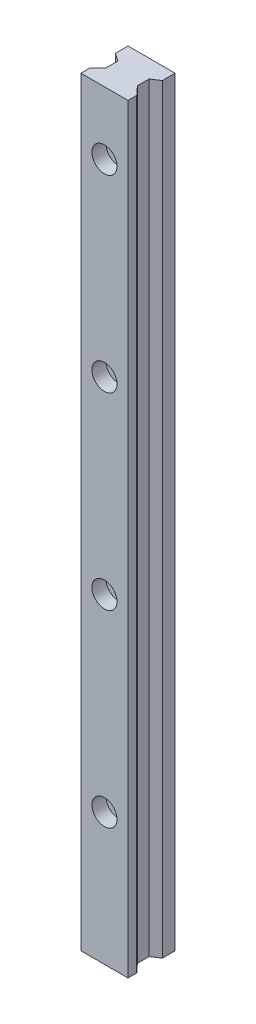
ISO-10303-21;
HEADER;
FILE_DESCRIPTION(('STEP AP214'),'2;1');
FILE_NAME('part.step','',(''),(''),'','','');
FILE_SCHEMA(('AUTOMOTIVE_DESIGN { 1 0 10303 214 1 1 1 1 }'));
ENDSEC;
DATA;
#1=APPLICATION_CONTEXT('core data for automotive mechanical design processes');
#2=APPLICATION_PROTOCOL_DEFINITION('international standard','automotive_design',2000,#1);
#3=PRODUCT_CONTEXT('',#1,'mechanical');
#4=PRODUCT('Part','Part','',(#3));
#5=PRODUCT_RELATED_PRODUCT_CATEGORY('part','',(#4));
#6=PRODUCT_DEFINITION_FORMATION('','',#4);
#7=PRODUCT_DEFINITION_CONTEXT('part definition',#1,'design');
#8=PRODUCT_DEFINITION('design','',#6,#7);
#9=PRODUCT_DEFINITION_SHAPE('','',#8);
#10=(LENGTH_UNIT() NAMED_UNIT(*) SI_UNIT(.MILLI.,.METRE.));
#11=(NAMED_UNIT(*) PLANE_ANGLE_UNIT() SI_UNIT($,.RADIAN.));
#12=(NAMED_UNIT(*) SI_UNIT($,.STERADIAN.) SOLID_ANGLE_UNIT());
#13=UNCERTAINTY_MEASURE_WITH_UNIT(LENGTH_MEASURE(1.E-05),#10,'distance_accuracy_value','');
#14=(GEOMETRIC_REPRESENTATION_CONTEXT(3) GLOBAL_UNCERTAINTY_ASSIGNED_CONTEXT((#13)) GLOBAL_UNIT_ASSIGNED_CONTEXT((#10,
#11,#12)) REPRESENTATION_CONTEXT('',''));
#15=CARTESIAN_POINT('',(0.,0.,0.));
#16=DIRECTION('',(0.,0.,1.));
#17=DIRECTION('',(1.,0.,0.));
#18=AXIS2_PLACEMENT_3D('',#15,#16,#17);
#19=CARTESIAN_POINT('',(0.,638.5,15.));
#20=DIRECTION('',(0.,0.,1.));
#21=DIRECTION('',(1.,0.,0.));
#22=AXIS2_PLACEMENT_3D('',#19,#20,#21);
#23=CYLINDRICAL_SURFACE('',#22,4.);
#24=CARTESIAN_POINT('',(0.,638.5,15.));
#25=DIRECTION('',(0.,0.,1.));
#26=DIRECTION('',(1.,0.,0.));
#27=AXIS2_PLACEMENT_3D('',#24,#25,#26);
#28=CIRCLE('',#27,4.);
#29=CARTESIAN_POINT('',(4.,638.5,15.));
#30=VERTEX_POINT('',#29);
#31=EDGE_CURVE('E142',#30,#30,#28,.F.);
#32=ORIENTED_EDGE('',*,*,#31,.F.);
#33=EDGE_LOOP('',(#32));
#34=FACE_BOUND('',#33,.T.);
#35=CARTESIAN_POINT('',(0.,638.5,10.5));
#36=DIRECTION('',(0.,0.,1.));
#37=DIRECTION('',(1.,0.,0.));
#38=AXIS2_PLACEMENT_3D('',#35,#36,#37);
#39=CIRCLE('',#38,4.);
#40=CARTESIAN_POINT('',(4.,638.5,10.5));
#41=VERTEX_POINT('',#40);
#42=EDGE_CURVE('E19',#41,#41,#39,.F.);
#43=ORIENTED_EDGE('',*,*,#42,.T.);
#44=EDGE_LOOP('',(#43));
#45=FACE_BOUND('',#44,.T.);
#46=ADVANCED_FACE('F16',(#34,#45),#23,.F.);
#47=CARTESIAN_POINT('',(0.,578.5,15.));
#48=DIRECTION('',(0.,0.,1.));
#49=DIRECTION('',(1.,0.,0.));
#50=AXIS2_PLACEMENT_3D('',#47,#48,#49);
#51=CYLINDRICAL_SURFACE('',#50,4.);
#52=CARTESIAN_POINT('',(0.,578.5,15.));
#53=DIRECTION('',(0.,0.,1.));
#54=DIRECTION('',(1.,0.,0.));
#55=AXIS2_PLACEMENT_3D('',#52,#53,#54);
#56=CIRCLE('',#55,4.);
#57=CARTESIAN_POINT('',(4.,578.5,15.));
#58=VERTEX_POINT('',#57);
#59=EDGE_CURVE('E178',#58,#58,#56,.F.);
#60=ORIENTED_EDGE('',*,*,#59,.F.);
#61=EDGE_LOOP('',(#60));
#62=FACE_BOUND('',#61,.T.);
#63=CARTESIAN_POINT('',(0.,578.5,10.5));
#64=DIRECTION('',(0.,0.,1.));
#65=DIRECTION('',(1.,0.,0.));
#66=AXIS2_PLACEMENT_3D('',#63,#64,#65);
#67=CIRCLE('',#66,4.);
#68=CARTESIAN_POINT('',(4.,578.5,10.5));
#69=VERTEX_POINT('',#68);
#70=EDGE_CURVE('E187',#69,#69,#67,.F.);
#71=ORIENTED_EDGE('',*,*,#70,.T.);
#72=EDGE_LOOP('',(#71));
#73=FACE_BOUND('',#72,.T.);
#74=ADVANCED_FACE('F292',(#62,#73),#51,.F.);
#75=CARTESIAN_POINT('',(0.,518.5,15.));
#76=DIRECTION('',(0.,0.,1.));
#77=DIRECTION('',(1.,0.,0.));
#78=AXIS2_PLACEMENT_3D('',#75,#76,#77);
#79=CYLINDRICAL_SURFACE('',#78,4.);
#80=CARTESIAN_POINT('',(0.,518.5,15.));
#81=DIRECTION('',(0.,0.,1.));
#82=DIRECTION('',(1.,0.,0.));
#83=AXIS2_PLACEMENT_3D('',#80,#81,#82);
#84=CIRCLE('',#83,4.);
#85=CARTESIAN_POINT('',(4.,518.5,15.));
#86=VERTEX_POINT('',#85);
#87=EDGE_CURVE('E175',#86,#86,#84,.F.);
#88=ORIENTED_EDGE('',*,*,#87,.F.);
#89=EDGE_LOOP('',(#88));
#90=FACE_BOUND('',#89,.T.);
#91=CARTESIAN_POINT('',(0.,518.5,10.5));
#92=DIRECTION('',(0.,0.,1.));
#93=DIRECTION('',(1.,0.,0.));
#94=AXIS2_PLACEMENT_3D('',#91,#92,#93);
#95=CIRCLE('',#94,4.);
#96=CARTESIAN_POINT('',(4.,518.5,10.5));
#97=VERTEX_POINT('',#96);
#98=EDGE_CURVE('E185',#97,#97,#95,.F.);
#99=ORIENTED_EDGE('',*,*,#98,.T.);
#100=EDGE_LOOP('',(#99));
#101=FACE_BOUND('',#100,.T.);
#102=ADVANCED_FACE('F289',(#90,#101),#79,.F.);
#103=CARTESIAN_POINT('',(0.,458.5,15.));
#104=DIRECTION('',(0.,0.,1.));
#105=DIRECTION('',(1.,0.,0.));
#106=AXIS2_PLACEMENT_3D('',#103,#104,#105);
#107=CYLINDRICAL_SURFACE('',#106,4.);
#108=CARTESIAN_POINT('',(0.,458.5,15.));
#109=DIRECTION('',(0.,0.,1.));
#110=DIRECTION('',(1.,0.,0.));
#111=AXIS2_PLACEMENT_3D('',#108,#109,#110);
#112=CIRCLE('',#111,4.);
#113=CARTESIAN_POINT('',(4.,458.5,15.));
#114=VERTEX_POINT('',#113);
#115=EDGE_CURVE('E140',#114,#114,#112,.F.);
#116=ORIENTED_EDGE('',*,*,#115,.F.);
#117=EDGE_LOOP('',(#116));
#118=FACE_BOUND('',#117,.T.);
#119=CARTESIAN_POINT('',(0.,458.5,10.5));
#120=DIRECTION('',(0.,0.,1.));
#121=DIRECTION('',(1.,0.,0.));
#122=AXIS2_PLACEMENT_3D('',#119,#120,#121);
#123=CIRCLE('',#122,4.);
#124=CARTESIAN_POINT('',(4.,458.5,10.5));
#125=VERTEX_POINT('',#124);
#126=EDGE_CURVE('E151',#125,#125,#123,.F.);
#127=ORIENTED_EDGE('',*,*,#126,.T.);
#128=EDGE_LOOP('',(#127));
#129=FACE_BOUND('',#128,.T.);
#130=ADVANCED_FACE('F199',(#118,#129),#107,.F.);
#131=CARTESIAN_POINT('',(2.25,638.5,10.5));
#132=DIRECTION('',(0.,0.,-1.));
#133=DIRECTION('',(-1.,0.,0.));
#134=AXIS2_PLACEMENT_3D('',#131,#132,#133);
#135=PLANE('',#134);
#136=ORIENTED_EDGE('',*,*,#42,.F.);
#137=EDGE_LOOP('',(#136));
#138=FACE_BOUND('',#137,.T.);
#139=CARTESIAN_POINT('',(0.,638.5,10.5));
#140=DIRECTION('',(0.,0.,1.));
#141=DIRECTION('',(1.,0.,0.));
#142=AXIS2_PLACEMENT_3D('',#139,#140,#141);
#143=CIRCLE('',#142,2.25);
#144=CARTESIAN_POINT('',(2.25,638.5,10.5));
#145=VERTEX_POINT('',#144);
#146=EDGE_CURVE('E139',#145,#145,#143,.F.);
#147=ORIENTED_EDGE('',*,*,#146,.T.);
#148=EDGE_LOOP('',(#147));
#149=FACE_BOUND('',#148,.T.);
#150=ADVANCED_FACE('F195',(#138,#149),#135,.F.);
#151=CARTESIAN_POINT('',(2.25,578.5,10.5));
#152=DIRECTION('',(0.,0.,-1.));
#153=DIRECTION('',(-1.,0.,0.));
#154=AXIS2_PLACEMENT_3D('',#151,#152,#153);
#155=PLANE('',#154);
#156=ORIENTED_EDGE('',*,*,#70,.F.);
#157=EDGE_LOOP('',(#156));
#158=FACE_BOUND('',#157,.T.);
#159=CARTESIAN_POINT('',(0.,578.5,10.5));
#160=DIRECTION('',(0.,0.,1.));
#161=DIRECTION('',(1.,0.,0.));
#162=AXIS2_PLACEMENT_3D('',#159,#160,#161);
#163=CIRCLE('',#162,2.25);
#164=CARTESIAN_POINT('',(2.25,578.5,10.5));
#165=VERTEX_POINT('',#164);
#166=EDGE_CURVE('E168',#165,#165,#163,.F.);
#167=ORIENTED_EDGE('',*,*,#166,.T.);
#168=EDGE_LOOP('',(#167));
#169=FACE_BOUND('',#168,.T.);
#170=ADVANCED_FACE('F198',(#158,#169),#155,.F.);
#171=CARTESIAN_POINT('',(2.25,518.5,10.5));
#172=DIRECTION('',(0.,0.,-1.));
#173=DIRECTION('',(-1.,0.,0.));
#174=AXIS2_PLACEMENT_3D('',#171,#172,#173);
#175=PLANE('',#174);
#176=ORIENTED_EDGE('',*,*,#98,.F.);
#177=EDGE_LOOP('',(#176));
#178=FACE_BOUND('',#177,.T.);
#179=CARTESIAN_POINT('',(0.,518.5,10.5));
#180=DIRECTION('',(0.,0.,1.));
#181=DIRECTION('',(1.,0.,0.));
#182=AXIS2_PLACEMENT_3D('',#179,#180,#181);
#183=CIRCLE('',#182,2.25);
#184=CARTESIAN_POINT('',(2.25,518.5,10.5));
#185=VERTEX_POINT('',#184);
#186=EDGE_CURVE('E133',#185,#185,#183,.F.);
#187=ORIENTED_EDGE('',*,*,#186,.T.);
#188=EDGE_LOOP('',(#187));
#189=FACE_BOUND('',#188,.T.);
#190=ADVANCED_FACE('F279',(#178,#189),#175,.F.);
#191=CARTESIAN_POINT('',(2.25,458.5,10.5));
#192=DIRECTION('',(0.,0.,-1.));
#193=DIRECTION('',(-1.,0.,0.));
#194=AXIS2_PLACEMENT_3D('',#191,#192,#193);
#195=PLANE('',#194);
#196=ORIENTED_EDGE('',*,*,#126,.F.);
#197=EDGE_LOOP('',(#196));
#198=FACE_BOUND('',#197,.T.);
#199=CARTESIAN_POINT('',(0.,458.5,10.5));
#200=DIRECTION('',(0.,0.,1.));
#201=DIRECTION('',(1.,0.,0.));
#202=AXIS2_PLACEMENT_3D('',#199,#200,#201);
#203=CIRCLE('',#202,2.25);
#204=CARTESIAN_POINT('',(2.25,458.5,10.5));
#205=VERTEX_POINT('',#204);
#206=EDGE_CURVE('E130',#205,#205,#203,.F.);
#207=ORIENTED_EDGE('',*,*,#206,.T.);
#208=EDGE_LOOP('',(#207));
#209=FACE_BOUND('',#208,.T.);
#210=ADVANCED_FACE('F275',(#198,#209),#195,.F.);
#211=CARTESIAN_POINT('',(7.5,200.,15.));
#212=DIRECTION('',(-1.,0.,0.));
#213=DIRECTION('',(0.,0.,1.));
#214=AXIS2_PLACEMENT_3D('',#211,#212,#213);
#215=PLANE('',#214);
#216=DIRECTION('',(0.,0.,1.));
#217=VECTOR('',#216,1.);
#218=CARTESIAN_POINT('',(7.5,416.5,-200.));
#219=LINE('',#218,#217);
#220=CARTESIAN_POINT('',(7.5,416.5,15.));
#221=VERTEX_POINT('',#220);
#222=CARTESIAN_POINT('',(7.50000000000001,416.5,12.21727469374));
#223=VERTEX_POINT('',#222);
#224=EDGE_CURVE('E355',#221,#223,#219,.F.);
#225=ORIENTED_EDGE('',*,*,#224,.T.);
#226=DIRECTION('',(0.,1.,0.));
#227=VECTOR('',#226,1.);
#228=CARTESIAN_POINT('',(7.5,200.,12.21727469374));
#229=LINE('',#228,#227);
#230=CARTESIAN_POINT('',(7.5,658.5,12.21727469374));
#231=VERTEX_POINT('',#230);
#232=EDGE_CURVE('E149',#223,#231,#229,.T.);
#233=ORIENTED_EDGE('',*,*,#232,.T.);
#234=DIRECTION('',(0.,0.,-1.));
#235=VECTOR('',#234,1.);
#236=CARTESIAN_POINT('',(7.5,658.5,-200.));
#237=LINE('',#236,#235);
#238=CARTESIAN_POINT('',(7.5,658.5,15.));
#239=VERTEX_POINT('',#238);
#240=EDGE_CURVE('E312',#231,#239,#237,.F.);
#241=ORIENTED_EDGE('',*,*,#240,.T.);
#242=DIRECTION('',(0.,1.,0.));
#243=VECTOR('',#242,1.);
#244=CARTESIAN_POINT('',(7.5,0.,15.));
#245=LINE('',#244,#243);
#246=EDGE_CURVE('E117',#221,#239,#245,.T.);
#247=ORIENTED_EDGE('',*,*,#246,.F.);
#248=EDGE_LOOP('',(#225,#233,#241,#247));
#249=FACE_BOUND('',#248,.T.);
#250=ADVANCED_FACE('F271',(#249),#215,.F.);
#251=CARTESIAN_POINT('',(7.5,200.,12.21727469374));
#252=DIRECTION('',(-0.73519614364749,0.,0.67785443154549));
#253=DIRECTION('',(0.67785443154549,0.,0.73519614364749));
#254=AXIS2_PLACEMENT_3D('',#251,#252,#253);
#255=PLANE('',#254);
#256=DIRECTION('',(-0.677854431545408,0.,-0.735196143647565));
#257=VECTOR('',#256,1.);
#258=CARTESIAN_POINT('',(7.5,416.5,12.21727469374));
#259=LINE('',#258,#257);
#260=CARTESIAN_POINT('',(4.95415811693084,416.5,9.45607251276214));
#261=VERTEX_POINT('',#260);
#262=EDGE_CURVE('E352',#223,#261,#259,.T.);
#263=ORIENTED_EDGE('',*,*,#262,.T.);
#264=DIRECTION('',(0.,1.,0.));
#265=VECTOR('',#264,1.);
#266=CARTESIAN_POINT('',(4.954158116931,200.,9.456072512762));
#267=LINE('',#266,#265);
#268=CARTESIAN_POINT('',(4.95415811693093,658.5,9.4560725127621));
#269=VERTEX_POINT('',#268);
#270=EDGE_CURVE('E147',#261,#269,#267,.T.);
#271=ORIENTED_EDGE('',*,*,#270,.T.);
#272=DIRECTION('',(0.677854431545408,0.,0.735196143647565));
#273=VECTOR('',#272,1.);
#274=CARTESIAN_POINT('',(4.954158116931,658.5,9.45607251276201));
#275=LINE('',#274,#273);
#276=EDGE_CURVE('E317',#269,#231,#275,.T.);
#277=ORIENTED_EDGE('',*,*,#276,.T.);
#278=ORIENTED_EDGE('',*,*,#232,.F.);
#279=EDGE_LOOP('',(#263,#271,#277,#278));
#280=FACE_BOUND('',#279,.T.);
#281=ADVANCED_FACE('F267',(#280),#255,.F.);
#282=CARTESIAN_POINT('',(4.954158116931,200.,9.456072512762));
#283=DIRECTION('',(-1.,0.,0.));
#284=DIRECTION('',(0.,0.,1.));
#285=AXIS2_PLACEMENT_3D('',#282,#283,#284);
#286=PLANE('',#285);
#287=DIRECTION('',(0.,0.,1.));
#288=VECTOR('',#287,1.);
#289=CARTESIAN_POINT('',(4.954158116931,416.5,-200.));
#290=LINE('',#289,#288);
#291=CARTESIAN_POINT('',(4.954158116931,416.5,5.731298607799));
#292=VERTEX_POINT('',#291);
#293=EDGE_CURVE('E349',#261,#292,#290,.F.);
#294=ORIENTED_EDGE('',*,*,#293,.T.);
#295=DIRECTION('',(0.,1.,0.));
#296=VECTOR('',#295,1.);
#297=CARTESIAN_POINT('',(4.954158116931,200.,5.731298607799));
#298=LINE('',#297,#296);
#299=CARTESIAN_POINT('',(4.954158116931,658.5,5.731298607799));
#300=VERTEX_POINT('',#299);
#301=EDGE_CURVE('E137',#292,#300,#298,.T.);
#302=ORIENTED_EDGE('',*,*,#301,.T.);
#303=DIRECTION('',(0.,0.,-1.));
#304=VECTOR('',#303,1.);
#305=CARTESIAN_POINT('',(4.954158116931,658.5,-200.));
#306=LINE('',#305,#304);
#307=EDGE_CURVE('E323',#300,#269,#306,.F.);
#308=ORIENTED_EDGE('',*,*,#307,.T.);
#309=ORIENTED_EDGE('',*,*,#270,.F.);
#310=EDGE_LOOP('',(#294,#302,#308,#309));
#311=FACE_BOUND('',#310,.T.);
#312=ADVANCED_FACE('F263',(#311),#286,.F.);
#313=CARTESIAN_POINT('',(-4.954158116931,200.,5.731298607799));
#314=DIRECTION('',(0.551556138662193,0.,-0.834137773934289));
#315=DIRECTION('',(-0.834137773934289,0.,-0.551556138662193));
#316=AXIS2_PLACEMENT_3D('',#313,#314,#315);
#317=PLANE('',#316);
#318=DIRECTION('',(0.834137773934291,0.,0.55155613866219));
#319=VECTOR('',#318,1.);
#320=CARTESIAN_POINT('',(-7.5,416.5,4.04791396493948));
#321=LINE('',#320,#319);
#322=CARTESIAN_POINT('',(-7.50000000000001,416.5,4.04791396493922));
#323=VERTEX_POINT('',#322);
#324=CARTESIAN_POINT('',(-4.954158116931,416.5,5.731298607799));
#325=VERTEX_POINT('',#324);
#326=EDGE_CURVE('E339',#323,#325,#321,.T.);
#327=ORIENTED_EDGE('',*,*,#326,.T.);
#328=DIRECTION('',(0.,1.,0.));
#329=VECTOR('',#328,1.);
#330=CARTESIAN_POINT('',(-4.954158116931,200.,5.731298607799));
#331=LINE('',#330,#329);
#332=CARTESIAN_POINT('',(-4.954158116931,658.5,5.731298607799));
#333=VERTEX_POINT('',#332);
#334=EDGE_CURVE('E145',#325,#333,#331,.T.);
#335=ORIENTED_EDGE('',*,*,#334,.T.);
#336=DIRECTION('',(-0.83413777393422,0.,-0.551556138662298));
#337=VECTOR('',#336,1.);
#338=CARTESIAN_POINT('',(-4.954158116931,658.5,5.731298607799));
#339=LINE('',#338,#337);
#340=CARTESIAN_POINT('',(-7.5,658.5,4.04791396493912));
#341=VERTEX_POINT('',#340);
#342=EDGE_CURVE('E329',#333,#341,#339,.T.);
#343=ORIENTED_EDGE('',*,*,#342,.T.);
#344=DIRECTION('',(0.,1.,0.));
#345=VECTOR('',#344,1.);
#346=CARTESIAN_POINT('',(-7.5,200.,4.047913964939));
#347=LINE('',#346,#345);
#348=EDGE_CURVE('E315',#341,#323,#347,.F.);
#349=ORIENTED_EDGE('',*,*,#348,.T.);
#350=EDGE_LOOP('',(#327,#335,#343,#349));
#351=FACE_BOUND('',#350,.T.);
#352=ADVANCED_FACE('F259',(#351),#317,.F.);
#353=CARTESIAN_POINT('',(-4.954158116931,200.,9.456072512762));
#354=DIRECTION('',(1.,0.,0.));
#355=DIRECTION('',(0.,0.,-1.));
#356=AXIS2_PLACEMENT_3D('',#353,#354,#355);
#357=PLANE('',#356);
#358=DIRECTION('',(0.,0.,1.));
#359=VECTOR('',#358,1.);
#360=CARTESIAN_POINT('',(-4.954158116931,416.5,-200.));
#361=LINE('',#360,#359);
#362=CARTESIAN_POINT('',(-4.95415811693095,416.5,9.45607251276231));
#363=VERTEX_POINT('',#362);
#364=EDGE_CURVE('E332',#325,#363,#361,.T.);
#365=ORIENTED_EDGE('',*,*,#364,.T.);
#366=DIRECTION('',(0.,1.,0.));
#367=VECTOR('',#366,1.);
#368=CARTESIAN_POINT('',(-4.95415811693083,200.,9.45607251276244));
#369=LINE('',#368,#367);
#370=CARTESIAN_POINT('',(-4.95415811693091,658.5,9.45607251276236));
#371=VERTEX_POINT('',#370);
#372=EDGE_CURVE('E118',#363,#371,#369,.T.);
#373=ORIENTED_EDGE('',*,*,#372,.T.);
#374=DIRECTION('',(0.,0.,-1.));
#375=VECTOR('',#374,1.);
#376=CARTESIAN_POINT('',(-4.954158116931,658.5,-200.));
#377=LINE('',#376,#375);
#378=EDGE_CURVE('E125',#371,#333,#377,.T.);
#379=ORIENTED_EDGE('',*,*,#378,.T.);
#380=ORIENTED_EDGE('',*,*,#334,.F.);
#381=EDGE_LOOP('',(#365,#373,#379,#380));
#382=FACE_BOUND('',#381,.T.);
#383=ADVANCED_FACE('F256',(#382),#357,.F.);
#384=CARTESIAN_POINT('',(-7.5,200.,12.21727469374));
#385=DIRECTION('',(0.73519614364749,0.,0.67785443154549));
#386=DIRECTION('',(0.67785443154549,0.,-0.73519614364749));
#387=AXIS2_PLACEMENT_3D('',#384,#385,#386);
#388=PLANE('',#387);
#389=DIRECTION('',(-0.677854431545445,0.,0.735196143647531));
#390=VECTOR('',#389,1.);
#391=CARTESIAN_POINT('',(-4.954158116931,416.5,9.45607251276229));
#392=LINE('',#391,#390);
#393=CARTESIAN_POINT('',(-7.5,416.5,12.21727469374));
#394=VERTEX_POINT('',#393);
#395=EDGE_CURVE('E113',#363,#394,#392,.T.);
#396=ORIENTED_EDGE('',*,*,#395,.T.);
#397=DIRECTION('',(0.,1.,0.));
#398=VECTOR('',#397,1.);
#399=CARTESIAN_POINT('',(-7.5,200.,12.21727469374));
#400=LINE('',#399,#398);
#401=CARTESIAN_POINT('',(-7.5,658.5,12.21727469374));
#402=VERTEX_POINT('',#401);
#403=EDGE_CURVE('E109',#394,#402,#400,.T.);
#404=ORIENTED_EDGE('',*,*,#403,.T.);
#405=DIRECTION('',(0.677854431545445,0.,-0.735196143647531));
#406=VECTOR('',#405,1.);
#407=CARTESIAN_POINT('',(-7.5,658.5,12.21727469374));
#408=LINE('',#407,#406);
#409=EDGE_CURVE('E111',#402,#371,#408,.T.);
#410=ORIENTED_EDGE('',*,*,#409,.T.);
#411=ORIENTED_EDGE('',*,*,#372,.F.);
#412=EDGE_LOOP('',(#396,#404,#410,#411));
#413=FACE_BOUND('',#412,.T.);
#414=ADVANCED_FACE('F110',(#413),#388,.F.);
#415=CARTESIAN_POINT('',(-7.5,200.,15.));
#416=DIRECTION('',(1.,0.,0.));
#417=DIRECTION('',(0.,0.,-1.));
#418=AXIS2_PLACEMENT_3D('',#415,#416,#417);
#419=PLANE('',#418);
#420=DIRECTION('',(0.,0.,1.));
#421=VECTOR('',#420,1.);
#422=CARTESIAN_POINT('',(-7.5,416.5,-200.));
#423=LINE('',#422,#421);
#424=CARTESIAN_POINT('',(-7.5,416.5,15.));
#425=VERTEX_POINT('',#424);
#426=EDGE_CURVE('E335',#394,#425,#423,.T.);
#427=ORIENTED_EDGE('',*,*,#426,.T.);
#428=DIRECTION('',(0.,1.,0.));
#429=VECTOR('',#428,1.);
#430=CARTESIAN_POINT('',(-7.5,0.,15.));
#431=LINE('',#430,#429);
#432=CARTESIAN_POINT('',(-7.5,658.5,15.));
#433=VERTEX_POINT('',#432);
#434=EDGE_CURVE('E128',#433,#425,#431,.F.);
#435=ORIENTED_EDGE('',*,*,#434,.F.);
#436=DIRECTION('',(0.,0.,-1.));
#437=VECTOR('',#436,1.);
#438=CARTESIAN_POINT('',(-7.5,658.5,-200.));
#439=LINE('',#438,#437);
#440=EDGE_CURVE('E103',#433,#402,#439,.T.);
#441=ORIENTED_EDGE('',*,*,#440,.T.);
#442=ORIENTED_EDGE('',*,*,#403,.F.);
#443=EDGE_LOOP('',(#427,#435,#441,#442));
#444=FACE_BOUND('',#443,.T.);
#445=ADVANCED_FACE('F127',(#444),#419,.F.);
#446=CARTESIAN_POINT('',(0.,0.,15.));
#447=DIRECTION('',(0.,0.,1.));
#448=DIRECTION('',(1.,0.,0.));
#449=AXIS2_PLACEMENT_3D('',#446,#447,#448);
#450=PLANE('',#449);
#451=ORIENTED_EDGE('',*,*,#115,.T.);
#452=EDGE_LOOP('',(#451));
#453=FACE_BOUND('',#452,.T.);
#454=ORIENTED_EDGE('',*,*,#87,.T.);
#455=EDGE_LOOP('',(#454));
#456=FACE_BOUND('',#455,.T.);
#457=ORIENTED_EDGE('',*,*,#59,.T.);
#458=EDGE_LOOP('',(#457));
#459=FACE_BOUND('',#458,.T.);
#460=ORIENTED_EDGE('',*,*,#31,.T.);
#461=EDGE_LOOP('',(#460));
#462=FACE_BOUND('',#461,.T.);
#463=DIRECTION('',(1.,0.,0.));
#464=VECTOR('',#463,1.);
#465=CARTESIAN_POINT('',(-43.6398609986848,658.5,15.));
#466=LINE('',#465,#464);
#467=EDGE_CURVE('E306',#239,#433,#466,.F.);
#468=ORIENTED_EDGE('',*,*,#467,.T.);
#469=ORIENTED_EDGE('',*,*,#434,.T.);
#470=DIRECTION('',(1.,0.,0.));
#471=VECTOR('',#470,1.);
#472=CARTESIAN_POINT('',(-15.8348903814837,416.5,15.));
#473=LINE('',#472,#471);
#474=EDGE_CURVE('E337',#425,#221,#473,.T.);
#475=ORIENTED_EDGE('',*,*,#474,.T.);
#476=ORIENTED_EDGE('',*,*,#246,.T.);
#477=EDGE_LOOP('',(#468,#469,#475,#476));
#478=FACE_BOUND('',#477,.T.);
#479=ADVANCED_FACE('F247',(#453,#456,#459,#462,#478),#450,.T.);
#480=CARTESIAN_POINT('',(4.954158116931,200.,5.731298607799));
#481=DIRECTION('',(-0.551556138662193,0.,-0.834137773934289));
#482=DIRECTION('',(-0.834137773934289,0.,0.551556138662193));
#483=AXIS2_PLACEMENT_3D('',#480,#481,#482);
#484=PLANE('',#483);
#485=DIRECTION('',(0.83413777393422,0.,-0.551556138662298));
#486=VECTOR('',#485,1.);
#487=CARTESIAN_POINT('',(4.954158116931,416.5,5.731298607799));
#488=LINE('',#487,#486);
#489=CARTESIAN_POINT('',(7.50000000000005,416.5,4.04791396493908));
#490=VERTEX_POINT('',#489);
#491=EDGE_CURVE('E347',#292,#490,#488,.T.);
#492=ORIENTED_EDGE('',*,*,#491,.T.);
#493=DIRECTION('',(0.,1.,0.));
#494=VECTOR('',#493,1.);
#495=CARTESIAN_POINT('',(7.5,200.,4.047913964939));
#496=LINE('',#495,#494);
#497=CARTESIAN_POINT('',(7.50000000000006,658.5,4.04791396493906));
#498=VERTEX_POINT('',#497);
#499=EDGE_CURVE('E164',#490,#498,#496,.T.);
#500=ORIENTED_EDGE('',*,*,#499,.T.);
#501=DIRECTION('',(-0.83413777393422,0.,0.551556138662298));
#502=VECTOR('',#501,1.);
#503=CARTESIAN_POINT('',(7.5,658.5,4.047913964939));
#504=LINE('',#503,#502);
#505=EDGE_CURVE('E326',#498,#300,#504,.T.);
#506=ORIENTED_EDGE('',*,*,#505,.T.);
#507=ORIENTED_EDGE('',*,*,#301,.F.);
#508=EDGE_LOOP('',(#492,#500,#506,#507));
#509=FACE_BOUND('',#508,.T.);
#510=ADVANCED_FACE('F207',(#509),#484,.F.);
#511=CARTESIAN_POINT('',(0.,638.5,15.));
#512=DIRECTION('',(0.,0.,1.));
#513=DIRECTION('',(1.,0.,0.));
#514=AXIS2_PLACEMENT_3D('',#511,#512,#513);
#515=CYLINDRICAL_SURFACE('',#514,2.25);
#516=ORIENTED_EDGE('',*,*,#146,.F.);
#517=EDGE_LOOP('',(#516));
#518=FACE_BOUND('',#517,.T.);
#519=CARTESIAN_POINT('',(0.,638.5,0.));
#520=DIRECTION('',(0.,0.,1.));
#521=DIRECTION('',(1.,0.,0.));
#522=AXIS2_PLACEMENT_3D('',#519,#520,#521);
#523=CIRCLE('',#522,2.25);
#524=CARTESIAN_POINT('',(2.25,638.5,0.));
#525=VERTEX_POINT('',#524);
#526=EDGE_CURVE('E162',#525,#525,#523,.F.);
#527=ORIENTED_EDGE('',*,*,#526,.T.);
#528=EDGE_LOOP('',(#527));
#529=FACE_BOUND('',#528,.T.);
#530=ADVANCED_FACE('F203',(#518,#529),#515,.F.);
#531=CARTESIAN_POINT('',(0.,578.5,15.));
#532=DIRECTION('',(0.,0.,1.));
#533=DIRECTION('',(1.,0.,0.));
#534=AXIS2_PLACEMENT_3D('',#531,#532,#533);
#535=CYLINDRICAL_SURFACE('',#534,2.25);
#536=ORIENTED_EDGE('',*,*,#166,.F.);
#537=EDGE_LOOP('',(#536));
#538=FACE_BOUND('',#537,.T.);
#539=CARTESIAN_POINT('',(0.,578.5,0.));
#540=DIRECTION('',(0.,0.,1.));
#541=DIRECTION('',(1.,0.,0.));
#542=AXIS2_PLACEMENT_3D('',#539,#540,#541);
#543=CIRCLE('',#542,2.25);
#544=CARTESIAN_POINT('',(2.25,578.5,0.));
#545=VERTEX_POINT('',#544);
#546=EDGE_CURVE('E159',#545,#545,#543,.F.);
#547=ORIENTED_EDGE('',*,*,#546,.T.);
#548=EDGE_LOOP('',(#547));
#549=FACE_BOUND('',#548,.T.);
#550=ADVANCED_FACE('F206',(#538,#549),#535,.F.);
#551=CARTESIAN_POINT('',(0.,518.5,15.));
#552=DIRECTION('',(0.,0.,1.));
#553=DIRECTION('',(1.,0.,0.));
#554=AXIS2_PLACEMENT_3D('',#551,#552,#553);
#555=CYLINDRICAL_SURFACE('',#554,2.25);
#556=ORIENTED_EDGE('',*,*,#186,.F.);
#557=EDGE_LOOP('',(#556));
#558=FACE_BOUND('',#557,.T.);
#559=CARTESIAN_POINT('',(0.,518.5,0.));
#560=DIRECTION('',(0.,0.,1.));
#561=DIRECTION('',(1.,0.,0.));
#562=AXIS2_PLACEMENT_3D('',#559,#560,#561);
#563=CIRCLE('',#562,2.25);
#564=CARTESIAN_POINT('',(2.25,518.5,0.));
#565=VERTEX_POINT('',#564);
#566=EDGE_CURVE('E156',#565,#565,#563,.F.);
#567=ORIENTED_EDGE('',*,*,#566,.T.);
#568=EDGE_LOOP('',(#567));
#569=FACE_BOUND('',#568,.T.);
#570=ADVANCED_FACE('F237',(#558,#569),#555,.F.);
#571=CARTESIAN_POINT('',(0.,458.5,15.));
#572=DIRECTION('',(0.,0.,1.));
#573=DIRECTION('',(1.,0.,0.));
#574=AXIS2_PLACEMENT_3D('',#571,#572,#573);
#575=CYLINDRICAL_SURFACE('',#574,2.25);
#576=ORIENTED_EDGE('',*,*,#206,.F.);
#577=EDGE_LOOP('',(#576));
#578=FACE_BOUND('',#577,.T.);
#579=CARTESIAN_POINT('',(0.,458.5,0.));
#580=DIRECTION('',(0.,0.,1.));
#581=DIRECTION('',(1.,0.,0.));
#582=AXIS2_PLACEMENT_3D('',#579,#580,#581);
#583=CIRCLE('',#582,2.25);
#584=CARTESIAN_POINT('',(2.25,458.5,0.));
#585=VERTEX_POINT('',#584);
#586=EDGE_CURVE('E152',#585,#585,#583,.F.);
#587=ORIENTED_EDGE('',*,*,#586,.T.);
#588=EDGE_LOOP('',(#587));
#589=FACE_BOUND('',#588,.T.);
#590=ADVANCED_FACE('F234',(#578,#589),#575,.F.);
#591=CARTESIAN_POINT('',(-43.6398609986848,658.5,-200.));
#592=DIRECTION('',(0.,-1.,0.));
#593=DIRECTION('',(0.,0.,-1.));
#594=AXIS2_PLACEMENT_3D('',#591,#592,#593);
#595=PLANE('',#594);
#596=ORIENTED_EDGE('',*,*,#240,.F.);
#597=ORIENTED_EDGE('',*,*,#276,.F.);
#598=ORIENTED_EDGE('',*,*,#307,.F.);
#599=ORIENTED_EDGE('',*,*,#505,.F.);
#600=DIRECTION('',(0.,0.,1.));
#601=VECTOR('',#600,1.);
#602=CARTESIAN_POINT('',(7.5,658.5,15.));
#603=LINE('',#602,#601);
#604=CARTESIAN_POINT('',(7.5,658.5,0.));
#605=VERTEX_POINT('',#604);
#606=EDGE_CURVE('E370',#498,#605,#603,.F.);
#607=ORIENTED_EDGE('',*,*,#606,.T.);
#608=DIRECTION('',(1.,0.,0.));
#609=VECTOR('',#608,1.);
#610=CARTESIAN_POINT('',(0.,658.5,0.));
#611=LINE('',#610,#609);
#612=CARTESIAN_POINT('',(-7.5,658.5,0.));
#613=VERTEX_POINT('',#612);
#614=EDGE_CURVE('E155',#605,#613,#611,.F.);
#615=ORIENTED_EDGE('',*,*,#614,.T.);
#616=DIRECTION('',(0.,0.,-1.));
#617=VECTOR('',#616,1.);
#618=CARTESIAN_POINT('',(-7.5,658.5,15.));
#619=LINE('',#618,#617);
#620=EDGE_CURVE('E311',#613,#341,#619,.F.);
#621=ORIENTED_EDGE('',*,*,#620,.T.);
#622=ORIENTED_EDGE('',*,*,#342,.F.);
#623=ORIENTED_EDGE('',*,*,#378,.F.);
#624=ORIENTED_EDGE('',*,*,#409,.F.);
#625=ORIENTED_EDGE('',*,*,#440,.F.);
#626=ORIENTED_EDGE('',*,*,#467,.F.);
#627=EDGE_LOOP('',(#596,#597,#598,#599,#607,#615,#621,#622,#623,#624,#625,#626));
#628=FACE_BOUND('',#627,.T.);
#629=ADVANCED_FACE('F122',(#628),#595,.F.);
#630=CARTESIAN_POINT('',(-7.5,200.,15.));
#631=DIRECTION('',(1.,0.,0.));
#632=DIRECTION('',(0.,0.,-1.));
#633=AXIS2_PLACEMENT_3D('',#630,#631,#632);
#634=PLANE('',#633);
#635=DIRECTION('',(0.,0.,1.));
#636=VECTOR('',#635,1.);
#637=CARTESIAN_POINT('',(-7.5,416.5,-200.));
#638=LINE('',#637,#636);
#639=CARTESIAN_POINT('',(-7.5,416.5,0.));
#640=VERTEX_POINT('',#639);
#641=EDGE_CURVE('E344',#640,#323,#638,.T.);
#642=ORIENTED_EDGE('',*,*,#641,.T.);
#643=ORIENTED_EDGE('',*,*,#348,.F.);
#644=ORIENTED_EDGE('',*,*,#620,.F.);
#645=DIRECTION('',(0.,1.,0.));
#646=VECTOR('',#645,1.);
#647=CARTESIAN_POINT('',(-7.5,0.,0.));
#648=LINE('',#647,#646);
#649=EDGE_CURVE('E361',#613,#640,#648,.F.);
#650=ORIENTED_EDGE('',*,*,#649,.T.);
#651=EDGE_LOOP('',(#642,#643,#644,#650));
#652=FACE_BOUND('',#651,.T.);
#653=ADVANCED_FACE('F227',(#652),#634,.F.);
#654=CARTESIAN_POINT('',(-15.8348903814837,416.5,-200.));
#655=DIRECTION('',(0.,1.,0.));
#656=DIRECTION('',(0.,0.,1.));
#657=AXIS2_PLACEMENT_3D('',#654,#655,#656);
#658=PLANE('',#657);
#659=ORIENTED_EDGE('',*,*,#426,.F.);
#660=ORIENTED_EDGE('',*,*,#395,.F.);
#661=ORIENTED_EDGE('',*,*,#364,.F.);
#662=ORIENTED_EDGE('',*,*,#326,.F.);
#663=ORIENTED_EDGE('',*,*,#641,.F.);
#664=DIRECTION('',(1.,0.,0.));
#665=VECTOR('',#664,1.);
#666=CARTESIAN_POINT('',(0.,416.5,0.));
#667=LINE('',#666,#665);
#668=CARTESIAN_POINT('',(7.5,416.5,0.));
#669=VERTEX_POINT('',#668);
#670=EDGE_CURVE('E25',#640,#669,#667,.T.);
#671=ORIENTED_EDGE('',*,*,#670,.T.);
#672=DIRECTION('',(0.,0.,1.));
#673=VECTOR('',#672,1.);
#674=CARTESIAN_POINT('',(7.5,416.5,15.));
#675=LINE('',#674,#673);
#676=EDGE_CURVE('E33',#669,#490,#675,.T.);
#677=ORIENTED_EDGE('',*,*,#676,.T.);
#678=ORIENTED_EDGE('',*,*,#491,.F.);
#679=ORIENTED_EDGE('',*,*,#293,.F.);
#680=ORIENTED_EDGE('',*,*,#262,.F.);
#681=ORIENTED_EDGE('',*,*,#224,.F.);
#682=ORIENTED_EDGE('',*,*,#474,.F.);
#683=EDGE_LOOP('',(#659,#660,#661,#662,#663,#671,#677,#678,#679,#680,#681,#682));
#684=FACE_BOUND('',#683,.T.);
#685=ADVANCED_FACE('F220',(#684),#658,.F.);
#686=CARTESIAN_POINT('',(7.5,200.,15.));
#687=DIRECTION('',(-1.,0.,0.));
#688=DIRECTION('',(0.,0.,1.));
#689=AXIS2_PLACEMENT_3D('',#686,#687,#688);
#690=PLANE('',#689);
#691=ORIENTED_EDGE('',*,*,#676,.F.);
#692=DIRECTION('',(0.,1.,0.));
#693=VECTOR('',#692,1.);
#694=CARTESIAN_POINT('',(7.5,0.,0.));
#695=LINE('',#694,#693);
#696=EDGE_CURVE('E11',#669,#605,#695,.T.);
#697=ORIENTED_EDGE('',*,*,#696,.T.);
#698=ORIENTED_EDGE('',*,*,#606,.F.);
#699=ORIENTED_EDGE('',*,*,#499,.F.);
#700=EDGE_LOOP('',(#691,#697,#698,#699));
#701=FACE_BOUND('',#700,.T.);
#702=ADVANCED_FACE('F213',(#701),#690,.F.);
#703=CARTESIAN_POINT('',(0.,0.,0.));
#704=DIRECTION('',(0.,0.,1.));
#705=DIRECTION('',(1.,0.,0.));
#706=AXIS2_PLACEMENT_3D('',#703,#704,#705);
#707=PLANE('',#706);
#708=ORIENTED_EDGE('',*,*,#670,.F.);
#709=ORIENTED_EDGE('',*,*,#649,.F.);
#710=ORIENTED_EDGE('',*,*,#614,.F.);
#711=ORIENTED_EDGE('',*,*,#696,.F.);
#712=EDGE_LOOP('',(#708,#709,#710,#711));
#713=FACE_BOUND('',#712,.T.);
#714=ORIENTED_EDGE('',*,*,#586,.F.);
#715=EDGE_LOOP('',(#714));
#716=FACE_BOUND('',#715,.T.);
#717=ORIENTED_EDGE('',*,*,#566,.F.);
#718=EDGE_LOOP('',(#717));
#719=FACE_BOUND('',#718,.T.);
#720=ORIENTED_EDGE('',*,*,#546,.F.);
#721=EDGE_LOOP('',(#720));
#722=FACE_BOUND('',#721,.T.);
#723=ORIENTED_EDGE('',*,*,#526,.F.);
#724=EDGE_LOOP('',(#723));
#725=FACE_BOUND('',#724,.T.);
#726=ADVANCED_FACE('F211',(#713,#716,#719,#722,#725),#707,.F.);
#727=CLOSED_SHELL('',(#46,#74,#102,#130,#150,#170,#190,#210,#250,#281,#312,#352,#383,#414,#445,
#479,#510,#530,#550,#570,#590,#629,#653,#685,#702,#726));
#728=MANIFOLD_SOLID_BREP('B1',#727);
#729=ADVANCED_BREP_SHAPE_REPRESENTATION('',(#18,#728),#14);
#730=SHAPE_DEFINITION_REPRESENTATION(#9,#729);
ENDSEC;
END-ISO-10303-21;
